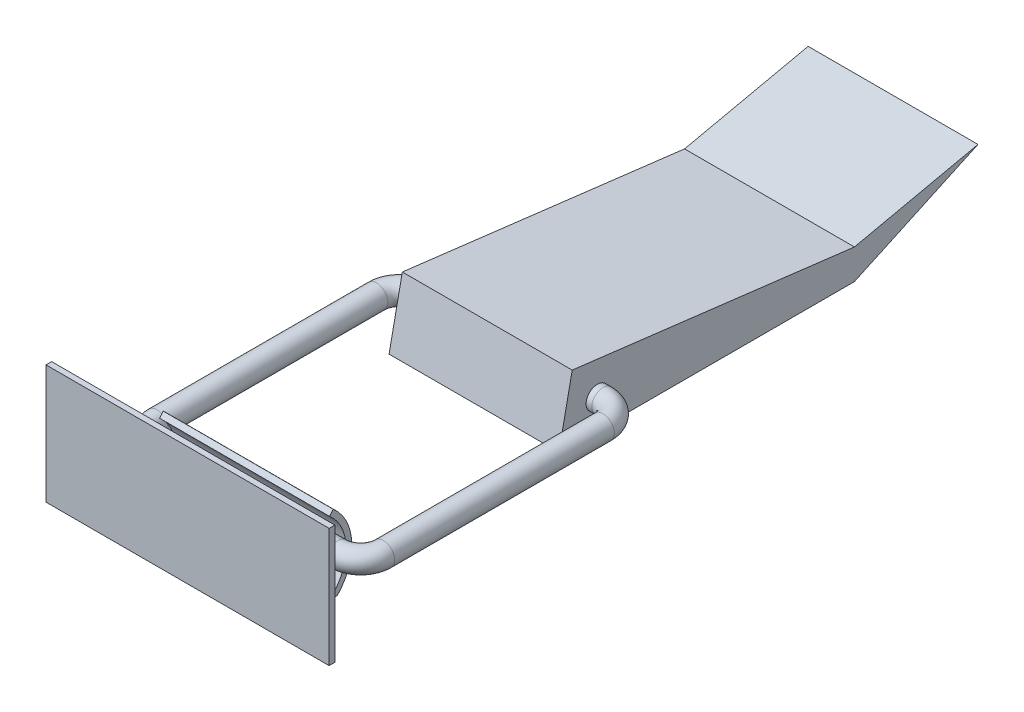
ISO-10303-21;
HEADER;
FILE_DESCRIPTION(('STEP AP214'),'2;1');
FILE_NAME('part.step','',(''),(''),'','','');
FILE_SCHEMA(('AUTOMOTIVE_DESIGN { 1 0 10303 214 1 1 1 1 }'));
ENDSEC;
DATA;
#1=APPLICATION_CONTEXT('core data for automotive mechanical design processes');
#2=APPLICATION_PROTOCOL_DEFINITION('international standard','automotive_design',2000,#1);
#3=PRODUCT_CONTEXT('',#1,'mechanical');
#4=PRODUCT('Part','Part','',(#3));
#5=PRODUCT_RELATED_PRODUCT_CATEGORY('part','',(#4));
#6=PRODUCT_DEFINITION_FORMATION('','',#4);
#7=PRODUCT_DEFINITION_CONTEXT('part definition',#1,'design');
#8=PRODUCT_DEFINITION('design','',#6,#7);
#9=PRODUCT_DEFINITION_SHAPE('','',#8);
#10=(LENGTH_UNIT() NAMED_UNIT(*) SI_UNIT(.MILLI.,.METRE.));
#11=(NAMED_UNIT(*) PLANE_ANGLE_UNIT() SI_UNIT($,.RADIAN.));
#12=(NAMED_UNIT(*) SI_UNIT($,.STERADIAN.) SOLID_ANGLE_UNIT());
#13=UNCERTAINTY_MEASURE_WITH_UNIT(LENGTH_MEASURE(1.E-05),#10,'distance_accuracy_value','');
#14=(GEOMETRIC_REPRESENTATION_CONTEXT(3) GLOBAL_UNCERTAINTY_ASSIGNED_CONTEXT((#13)) GLOBAL_UNIT_ASSIGNED_CONTEXT((#10,
#11,#12)) REPRESENTATION_CONTEXT('',''));
#15=CARTESIAN_POINT('',(0.,0.,0.));
#16=DIRECTION('',(0.,0.,1.));
#17=DIRECTION('',(1.,0.,0.));
#18=AXIS2_PLACEMENT_3D('',#15,#16,#17);
#19=CARTESIAN_POINT('',(15.,2.04308306827095,22.9774417731029));
#20=DIRECTION('',(-1.,0.,0.));
#21=DIRECTION('',(0.,0.,1.));
#22=AXIS2_PLACEMENT_3D('',#19,#20,#21);
#23=CYLINDRICAL_SURFACE('',#22,4.18803925481414);
#24=CARTESIAN_POINT('',(0.,2.04308306827095,22.9774417731029));
#25=DIRECTION('',(-1.,0.,0.));
#26=DIRECTION('',(0.,0.,1.));
#27=AXIS2_PLACEMENT_3D('',#24,#25,#26);
#28=CIRCLE('',#27,4.18803925481414);
#29=CARTESIAN_POINT('',(0.,5.22997262499521,20.2601990984222));
#30=VERTEX_POINT('',#29);
#31=CARTESIAN_POINT('',(0.,-0.674159606409742,19.7905522163787));
#32=VERTEX_POINT('',#31);
#33=EDGE_CURVE('E137',#30,#32,#28,.T.);
#34=ORIENTED_EDGE('',*,*,#33,.T.);
#35=DIRECTION('',(-1.,0.,0.));
#36=VECTOR('',#35,1.);
#37=CARTESIAN_POINT('',(15.,-0.674159606409742,19.7905522163787));
#38=LINE('',#37,#36);
#39=CARTESIAN_POINT('',(15.,-0.674159606409742,19.7905522163787));
#40=VERTEX_POINT('',#39);
#41=EDGE_CURVE('E62',#40,#32,#38,.T.);
#42=ORIENTED_EDGE('',*,*,#41,.F.);
#43=CARTESIAN_POINT('',(15.,2.04308306827095,22.9774417731029));
#44=DIRECTION('',(-1.,0.,0.));
#45=DIRECTION('',(0.,0.,1.));
#46=AXIS2_PLACEMENT_3D('',#43,#44,#45);
#47=CIRCLE('',#46,4.18803925481414);
#48=CARTESIAN_POINT('',(15.,5.22997262499521,20.2601990984222));
#49=VERTEX_POINT('',#48);
#50=EDGE_CURVE('E147',#49,#40,#47,.T.);
#51=ORIENTED_EDGE('',*,*,#50,.F.);
#52=DIRECTION('',(-1.,0.,0.));
#53=VECTOR('',#52,1.);
#54=CARTESIAN_POINT('',(15.,5.22997262499521,20.2601990984222));
#55=LINE('',#54,#53);
#56=EDGE_CURVE('E133',#49,#30,#55,.T.);
#57=ORIENTED_EDGE('',*,*,#56,.T.);
#58=EDGE_LOOP('',(#34,#42,#51,#57));
#59=FACE_BOUND('',#58,.T.);
#60=ADVANCED_FACE('F55',(#59),#23,.F.);
#61=CARTESIAN_POINT('',(15.,-0.674159606409742,19.7905522163787));
#62=DIRECTION('',(0.,-1.,0.));
#63=DIRECTION('',(0.,0.,-1.));
#64=AXIS2_PLACEMENT_3D('',#61,#62,#63);
#65=PLANE('',#64);
#66=DIRECTION('',(0.,0.,1.));
#67=VECTOR('',#66,1.);
#68=CARTESIAN_POINT('',(0.,-0.674159606409742,19.7905522163787));
#69=LINE('',#68,#67);
#70=CARTESIAN_POINT('',(0.,-0.674159606409743,24.7905522163787));
#71=VERTEX_POINT('',#70);
#72=EDGE_CURVE('E140',#32,#71,#69,.T.);
#73=ORIENTED_EDGE('',*,*,#72,.T.);
#74=DIRECTION('',(-1.,0.,0.));
#75=VECTOR('',#74,1.);
#76=CARTESIAN_POINT('',(15.,-0.674159606409743,24.7905522163787));
#77=LINE('',#76,#75);
#78=CARTESIAN_POINT('',(15.,-0.674159606409743,24.7905522163787));
#79=VERTEX_POINT('',#78);
#80=EDGE_CURVE('E158',#79,#71,#77,.T.);
#81=ORIENTED_EDGE('',*,*,#80,.F.);
#82=DIRECTION('',(0.,0.,1.));
#83=VECTOR('',#82,1.);
#84=CARTESIAN_POINT('',(15.,-0.674159606409742,19.7905522163787));
#85=LINE('',#84,#83);
#86=EDGE_CURVE('E106',#40,#79,#85,.T.);
#87=ORIENTED_EDGE('',*,*,#86,.F.);
#88=ORIENTED_EDGE('',*,*,#41,.T.);
#89=EDGE_LOOP('',(#73,#81,#87,#88));
#90=FACE_BOUND('',#89,.T.);
#91=ADVANCED_FACE('F161',(#90),#65,.F.);
#92=CARTESIAN_POINT('',(15.,-0.674159606409743,24.7905522163787));
#93=DIRECTION('',(0.,0.,1.));
#94=DIRECTION('',(1.,0.,0.));
#95=AXIS2_PLACEMENT_3D('',#92,#93,#94);
#96=PLANE('',#95);
#97=ORIENTED_EDGE('',*,*,#80,.T.);
#98=DIRECTION('',(0.,-1.,0.));
#99=VECTOR('',#98,1.);
#100=CARTESIAN_POINT('',(0.,2.04308306827095,24.7905522163787));
#101=LINE('',#100,#99);
#102=CARTESIAN_POINT('',(0.,-1.17415960640974,24.7905522163787));
#103=VERTEX_POINT('',#102);
#104=EDGE_CURVE('E13',#71,#103,#101,.T.);
#105=ORIENTED_EDGE('',*,*,#104,.T.);
#106=DIRECTION('',(1.,0.,0.));
#107=VECTOR('',#106,1.);
#108=CARTESIAN_POINT('',(-5.,-1.17415960640974,24.7905522163787));
#109=LINE('',#108,#107);
#110=CARTESIAN_POINT('',(-5.,-1.17415960640974,24.7905522163787));
#111=VERTEX_POINT('',#110);
#112=EDGE_CURVE('E174',#111,#103,#109,.T.);
#113=ORIENTED_EDGE('',*,*,#112,.F.);
#114=DIRECTION('',(0.,1.,0.));
#115=VECTOR('',#114,1.);
#116=CARTESIAN_POINT('',(-5.,-1.17415960640974,24.7905522163787));
#117=LINE('',#116,#115);
#118=CARTESIAN_POINT('',(-5.,9.32584039359026,24.7905522163787));
#119=VERTEX_POINT('',#118);
#120=EDGE_CURVE('E203',#111,#119,#117,.T.);
#121=ORIENTED_EDGE('',*,*,#120,.T.);
#122=DIRECTION('',(-1.,0.,0.));
#123=VECTOR('',#122,1.);
#124=CARTESIAN_POINT('',(15.,9.32584039359026,24.7905522163787));
#125=LINE('',#124,#123);
#126=CARTESIAN_POINT('',(20.,9.32584039359026,24.7905522163787));
#127=VERTEX_POINT('',#126);
#128=EDGE_CURVE('E155',#127,#119,#125,.T.);
#129=ORIENTED_EDGE('',*,*,#128,.F.);
#130=DIRECTION('',(0.,1.,0.));
#131=VECTOR('',#130,1.);
#132=CARTESIAN_POINT('',(20.,-1.17415960640974,24.7905522163787));
#133=LINE('',#132,#131);
#134=CARTESIAN_POINT('',(20.,-1.17415960640974,24.7905522163787));
#135=VERTEX_POINT('',#134);
#136=EDGE_CURVE('E189',#135,#127,#133,.T.);
#137=ORIENTED_EDGE('',*,*,#136,.F.);
#138=CARTESIAN_POINT('',(15.,-1.17415960640974,24.7905522163787));
#139=VERTEX_POINT('',#138);
#140=EDGE_CURVE('E179',#139,#135,#109,.T.);
#141=ORIENTED_EDGE('',*,*,#140,.F.);
#142=DIRECTION('',(0.,-1.,0.));
#143=VECTOR('',#142,1.);
#144=CARTESIAN_POINT('',(15.,2.04308306827095,24.7905522163787));
#145=LINE('',#144,#143);
#146=EDGE_CURVE('E69',#79,#139,#145,.T.);
#147=ORIENTED_EDGE('',*,*,#146,.F.);
#148=EDGE_LOOP('',(#97,#105,#113,#121,#129,#137,#141,#147));
#149=FACE_BOUND('',#148,.T.);
#150=ADVANCED_FACE('F171',(#149),#96,.F.);
#151=CARTESIAN_POINT('',(15.,9.32584039359026,25.2905522163787));
#152=DIRECTION('',(0.,-1.,0.));
#153=DIRECTION('',(0.,0.,-1.));
#154=AXIS2_PLACEMENT_3D('',#151,#152,#153);
#155=PLANE('',#154);
#156=ORIENTED_EDGE('',*,*,#128,.T.);
#157=DIRECTION('',(0.,0.,1.));
#158=VECTOR('',#157,1.);
#159=CARTESIAN_POINT('',(-5.,9.32584039359026,24.7905522163787));
#160=LINE('',#159,#158);
#161=CARTESIAN_POINT('',(-5.,9.32584039359026,25.2905522163787));
#162=VERTEX_POINT('',#161);
#163=EDGE_CURVE('E205',#119,#162,#160,.T.);
#164=ORIENTED_EDGE('',*,*,#163,.T.);
#165=DIRECTION('',(-1.,0.,0.));
#166=VECTOR('',#165,1.);
#167=CARTESIAN_POINT('',(15.,9.32584039359026,25.2905522163787));
#168=LINE('',#167,#166);
#169=CARTESIAN_POINT('',(20.,9.32584039359026,25.2905522163787));
#170=VERTEX_POINT('',#169);
#171=EDGE_CURVE('E152',#170,#162,#168,.T.);
#172=ORIENTED_EDGE('',*,*,#171,.F.);
#173=DIRECTION('',(0.,0.,1.));
#174=VECTOR('',#173,1.);
#175=CARTESIAN_POINT('',(20.,9.32584039359026,24.7905522163787));
#176=LINE('',#175,#174);
#177=EDGE_CURVE('E207',#127,#170,#176,.T.);
#178=ORIENTED_EDGE('',*,*,#177,.F.);
#179=EDGE_LOOP('',(#156,#164,#172,#178));
#180=FACE_BOUND('',#179,.T.);
#181=ADVANCED_FACE('F234',(#180),#155,.F.);
#182=CARTESIAN_POINT('',(15.,-1.17415960640974,25.2905522163787));
#183=DIRECTION('',(0.,0.,-1.));
#184=DIRECTION('',(-1.,0.,0.));
#185=AXIS2_PLACEMENT_3D('',#182,#183,#184);
#186=PLANE('',#185);
#187=ORIENTED_EDGE('',*,*,#171,.T.);
#188=DIRECTION('',(0.,-1.,0.));
#189=VECTOR('',#188,1.);
#190=CARTESIAN_POINT('',(-5.,9.32584039359026,25.2905522163787));
#191=LINE('',#190,#189);
#192=CARTESIAN_POINT('',(-5.,-1.17415960640974,25.2905522163787));
#193=VERTEX_POINT('',#192);
#194=EDGE_CURVE('E212',#162,#193,#191,.T.);
#195=ORIENTED_EDGE('',*,*,#194,.T.);
#196=DIRECTION('',(-1.,0.,0.));
#197=VECTOR('',#196,1.);
#198=CARTESIAN_POINT('',(15.,-1.17415960640974,25.2905522163787));
#199=LINE('',#198,#197);
#200=CARTESIAN_POINT('',(20.,-1.17415960640974,25.2905522163787));
#201=VERTEX_POINT('',#200);
#202=EDGE_CURVE('E128',#201,#193,#199,.T.);
#203=ORIENTED_EDGE('',*,*,#202,.F.);
#204=DIRECTION('',(0.,-1.,0.));
#205=VECTOR('',#204,1.);
#206=CARTESIAN_POINT('',(20.,9.32584039359026,25.2905522163787));
#207=LINE('',#206,#205);
#208=EDGE_CURVE('E202',#170,#201,#207,.T.);
#209=ORIENTED_EDGE('',*,*,#208,.F.);
#210=EDGE_LOOP('',(#187,#195,#203,#209));
#211=FACE_BOUND('',#210,.T.);
#212=ADVANCED_FACE('F218',(#211),#186,.F.);
#213=CARTESIAN_POINT('',(15.,-1.17415960640974,19.5675940306236));
#214=DIRECTION('',(0.,1.,0.));
#215=DIRECTION('',(0.,0.,1.));
#216=AXIS2_PLACEMENT_3D('',#213,#214,#215);
#217=PLANE('',#216);
#218=DIRECTION('',(0.,0.,-1.));
#219=VECTOR('',#218,1.);
#220=CARTESIAN_POINT('',(15.,-1.17415960640974,19.5675940306236));
#221=LINE('',#220,#219);
#222=CARTESIAN_POINT('',(15.,-1.17415960640974,19.5675940306236));
#223=VERTEX_POINT('',#222);
#224=EDGE_CURVE('E110',#139,#223,#221,.T.);
#225=ORIENTED_EDGE('',*,*,#224,.F.);
#226=ORIENTED_EDGE('',*,*,#140,.T.);
#227=DIRECTION('',(0.,0.,-1.));
#228=VECTOR('',#227,1.);
#229=CARTESIAN_POINT('',(20.,-1.17415960640974,25.2905522163787));
#230=LINE('',#229,#228);
#231=EDGE_CURVE('E193',#201,#135,#230,.T.);
#232=ORIENTED_EDGE('',*,*,#231,.F.);
#233=ORIENTED_EDGE('',*,*,#202,.T.);
#234=DIRECTION('',(0.,0.,-1.));
#235=VECTOR('',#234,1.);
#236=CARTESIAN_POINT('',(-5.,-1.17415960640974,25.2905522163787));
#237=LINE('',#236,#235);
#238=EDGE_CURVE('E178',#193,#111,#237,.T.);
#239=ORIENTED_EDGE('',*,*,#238,.T.);
#240=ORIENTED_EDGE('',*,*,#112,.T.);
#241=DIRECTION('',(0.,0.,-1.));
#242=VECTOR('',#241,1.);
#243=CARTESIAN_POINT('',(0.,-1.17415960640974,19.5675940306236));
#244=LINE('',#243,#242);
#245=CARTESIAN_POINT('',(0.,-1.17415960640974,19.5675940306236));
#246=VERTEX_POINT('',#245);
#247=EDGE_CURVE('E125',#103,#246,#244,.T.);
#248=ORIENTED_EDGE('',*,*,#247,.T.);
#249=DIRECTION('',(-1.,0.,0.));
#250=VECTOR('',#249,1.);
#251=CARTESIAN_POINT('',(15.,-1.17415960640974,19.5675940306236));
#252=LINE('',#251,#250);
#253=EDGE_CURVE('E121',#223,#246,#252,.T.);
#254=ORIENTED_EDGE('',*,*,#253,.F.);
#255=EDGE_LOOP('',(#225,#226,#232,#233,#239,#240,#248,#254));
#256=FACE_BOUND('',#255,.T.);
#257=ADVANCED_FACE('F122',(#256),#217,.F.);
#258=CARTESIAN_POINT('',(15.,2.04308306827095,22.9774417731029));
#259=DIRECTION('',(-1.,0.,0.));
#260=DIRECTION('',(0.,0.,1.));
#261=AXIS2_PLACEMENT_3D('',#258,#259,#260);
#262=CYLINDRICAL_SURFACE('',#261,4.68803925481414);
#263=CARTESIAN_POINT('',(0.,2.04308306827095,22.9774417731029));
#264=DIRECTION('',(1.,0.,0.));
#265=DIRECTION('',(0.,0.,1.));
#266=AXIS2_PLACEMENT_3D('',#263,#264,#265);
#267=CIRCLE('',#266,4.68803925481414);
#268=CARTESIAN_POINT('',(0.,5.61044775462311,19.9357939878974));
#269=VERTEX_POINT('',#268);
#270=EDGE_CURVE('E144',#246,#269,#267,.T.);
#271=ORIENTED_EDGE('',*,*,#270,.T.);
#272=DIRECTION('',(-1.,0.,0.));
#273=VECTOR('',#272,1.);
#274=CARTESIAN_POINT('',(15.,5.61044775462311,19.9357939878974));
#275=LINE('',#274,#273);
#276=CARTESIAN_POINT('',(15.,5.61044775462311,19.9357939878974));
#277=VERTEX_POINT('',#276);
#278=EDGE_CURVE('E129',#277,#269,#275,.T.);
#279=ORIENTED_EDGE('',*,*,#278,.F.);
#280=CARTESIAN_POINT('',(15.,2.04308306827095,22.9774417731029));
#281=DIRECTION('',(1.,0.,0.));
#282=DIRECTION('',(0.,0.,1.));
#283=AXIS2_PLACEMENT_3D('',#280,#281,#282);
#284=CIRCLE('',#283,4.68803925481414);
#285=EDGE_CURVE('E114',#223,#277,#284,.T.);
#286=ORIENTED_EDGE('',*,*,#285,.F.);
#287=ORIENTED_EDGE('',*,*,#253,.T.);
#288=EDGE_LOOP('',(#271,#279,#286,#287));
#289=FACE_BOUND('',#288,.T.);
#290=ADVANCED_FACE('F131',(#289),#262,.T.);
#291=CARTESIAN_POINT('',(15.,5.22997262499521,20.2601990984222));
#292=DIRECTION('',(0.,-0.648810221049685,-0.760950259255793));
#293=DIRECTION('',(0.,0.760950259255793,-0.648810221049685));
#294=AXIS2_PLACEMENT_3D('',#291,#292,#293);
#295=PLANE('',#294);
#296=DIRECTION('',(0.,-0.760950259255793,0.648810221049685));
#297=VECTOR('',#296,1.);
#298=CARTESIAN_POINT('',(0.,5.22997262499521,20.2601990984222));
#299=LINE('',#298,#297);
#300=EDGE_CURVE('E98',#269,#30,#299,.T.);
#301=ORIENTED_EDGE('',*,*,#300,.T.);
#302=ORIENTED_EDGE('',*,*,#56,.F.);
#303=DIRECTION('',(0.,-0.760950259255793,0.648810221049685));
#304=VECTOR('',#303,1.);
#305=CARTESIAN_POINT('',(15.,5.22997262499521,20.2601990984222));
#306=LINE('',#305,#304);
#307=EDGE_CURVE('E77',#277,#49,#306,.T.);
#308=ORIENTED_EDGE('',*,*,#307,.F.);
#309=ORIENTED_EDGE('',*,*,#278,.T.);
#310=EDGE_LOOP('',(#301,#302,#308,#309));
#311=FACE_BOUND('',#310,.T.);
#312=ADVANCED_FACE('F289',(#311),#295,.F.);
#313=CARTESIAN_POINT('',(15.,2.04308306827095,22.9774417731029));
#314=DIRECTION('',(-1.,0.,0.));
#315=DIRECTION('',(0.,0.,1.));
#316=AXIS2_PLACEMENT_3D('',#313,#314,#315);
#317=PLANE('',#316);
#318=ORIENTED_EDGE('',*,*,#86,.T.);
#319=ORIENTED_EDGE('',*,*,#146,.T.);
#320=ORIENTED_EDGE('',*,*,#224,.T.);
#321=ORIENTED_EDGE('',*,*,#285,.T.);
#322=ORIENTED_EDGE('',*,*,#307,.T.);
#323=ORIENTED_EDGE('',*,*,#50,.T.);
#324=EDGE_LOOP('',(#318,#319,#320,#321,#322,#323));
#325=FACE_BOUND('',#324,.T.);
#326=ADVANCED_FACE('F112',(#325),#317,.F.);
#327=CARTESIAN_POINT('',(0.,2.04308306827095,22.9774417731029));
#328=DIRECTION('',(-1.,0.,0.));
#329=DIRECTION('',(0.,0.,1.));
#330=AXIS2_PLACEMENT_3D('',#327,#328,#329);
#331=PLANE('',#330);
#332=ORIENTED_EDGE('',*,*,#104,.F.);
#333=ORIENTED_EDGE('',*,*,#72,.F.);
#334=ORIENTED_EDGE('',*,*,#33,.F.);
#335=ORIENTED_EDGE('',*,*,#300,.F.);
#336=ORIENTED_EDGE('',*,*,#270,.F.);
#337=ORIENTED_EDGE('',*,*,#247,.F.);
#338=EDGE_LOOP('',(#332,#333,#334,#335,#336,#337));
#339=FACE_BOUND('',#338,.T.);
#340=ADVANCED_FACE('F167',(#339),#331,.T.);
#341=CARTESIAN_POINT('',(-5.,0.,0.));
#342=DIRECTION('',(1.,0.,0.));
#343=DIRECTION('',(0.,0.,-1.));
#344=AXIS2_PLACEMENT_3D('',#341,#342,#343);
#345=PLANE('',#344);
#346=ORIENTED_EDGE('',*,*,#120,.F.);
#347=ORIENTED_EDGE('',*,*,#238,.F.);
#348=ORIENTED_EDGE('',*,*,#194,.F.);
#349=ORIENTED_EDGE('',*,*,#163,.F.);
#350=EDGE_LOOP('',(#346,#347,#348,#349));
#351=FACE_BOUND('',#350,.T.);
#352=ADVANCED_FACE('F224',(#351),#345,.F.);
#353=CARTESIAN_POINT('',(20.,0.,0.));
#354=DIRECTION('',(1.,0.,0.));
#355=DIRECTION('',(0.,0.,-1.));
#356=AXIS2_PLACEMENT_3D('',#353,#354,#355);
#357=PLANE('',#356);
#358=ORIENTED_EDGE('',*,*,#136,.T.);
#359=ORIENTED_EDGE('',*,*,#177,.T.);
#360=ORIENTED_EDGE('',*,*,#208,.T.);
#361=ORIENTED_EDGE('',*,*,#231,.T.);
#362=EDGE_LOOP('',(#358,#359,#360,#361));
#363=FACE_BOUND('',#362,.T.);
#364=ADVANCED_FACE('F198',(#363),#357,.T.);
#365=CLOSED_SHELL('',(#60,#91,#150,#181,#212,#257,#290,#312,#326,#340,#352,#364));
#366=MANIFOLD_SOLID_BREP('B2',#365);
#367=CARTESIAN_POINT('',(15.,0.,-26.0909090909091));
#368=DIRECTION('',(0.,1.,0.));
#369=DIRECTION('',(0.,0.,1.));
#370=AXIS2_PLACEMENT_3D('',#367,#368,#369);
#371=PLANE('',#370);
#372=DIRECTION('',(0.,0.,-1.));
#373=VECTOR('',#372,1.);
#374=CARTESIAN_POINT('',(0.,0.,-26.0909090909091));
#375=LINE('',#374,#373);
#376=CARTESIAN_POINT('',(0.,0.,0.));
#377=VERTEX_POINT('',#376);
#378=CARTESIAN_POINT('',(0.,0.,-26.0909090909091));
#379=VERTEX_POINT('',#378);
#380=EDGE_CURVE('E422',#377,#379,#375,.T.);
#381=ORIENTED_EDGE('',*,*,#380,.T.);
#382=DIRECTION('',(-1.,0.,0.));
#383=VECTOR('',#382,1.);
#384=CARTESIAN_POINT('',(15.,0.,-26.0909090909091));
#385=LINE('',#384,#383);
#386=CARTESIAN_POINT('',(15.,0.,-26.0909090909091));
#387=VERTEX_POINT('',#386);
#388=EDGE_CURVE('E354',#387,#379,#385,.T.);
#389=ORIENTED_EDGE('',*,*,#388,.F.);
#390=DIRECTION('',(0.,0.,-1.));
#391=VECTOR('',#390,1.);
#392=CARTESIAN_POINT('',(15.,0.,-26.0909090909091));
#393=LINE('',#392,#391);
#394=CARTESIAN_POINT('',(15.,0.,0.));
#395=VERTEX_POINT('',#394);
#396=EDGE_CURVE('E431',#395,#387,#393,.T.);
#397=ORIENTED_EDGE('',*,*,#396,.F.);
#398=DIRECTION('',(-1.,0.,0.));
#399=VECTOR('',#398,1.);
#400=CARTESIAN_POINT('',(15.,0.,0.));
#401=LINE('',#400,#399);
#402=EDGE_CURVE('E418',#395,#377,#401,.T.);
#403=ORIENTED_EDGE('',*,*,#402,.T.);
#404=EDGE_LOOP('',(#381,#389,#397,#403));
#405=FACE_BOUND('',#404,.T.);
#406=ADVANCED_FACE('F346',(#405),#371,.F.);
#407=CARTESIAN_POINT('',(15.,5.03627859485815,-37.));
#408=DIRECTION('',(0.,0.907917784313585,0.419148299444375));
#409=DIRECTION('',(0.,-0.419148299444375,0.907917784313585));
#410=AXIS2_PLACEMENT_3D('',#407,#408,#409);
#411=PLANE('',#410);
#412=DIRECTION('',(0.,0.419148299444375,-0.907917784313585));
#413=VECTOR('',#412,1.);
#414=CARTESIAN_POINT('',(0.,5.03627859485815,-37.));
#415=LINE('',#414,#413);
#416=CARTESIAN_POINT('',(0.,5.03627859485815,-37.));
#417=VERTEX_POINT('',#416);
#418=EDGE_CURVE('E425',#379,#417,#415,.T.);
#419=ORIENTED_EDGE('',*,*,#418,.T.);
#420=DIRECTION('',(-1.,0.,0.));
#421=VECTOR('',#420,1.);
#422=CARTESIAN_POINT('',(15.,5.03627859485815,-37.));
#423=LINE('',#422,#421);
#424=CARTESIAN_POINT('',(15.,5.03627859485815,-37.));
#425=VERTEX_POINT('',#424);
#426=EDGE_CURVE('E413',#425,#417,#423,.T.);
#427=ORIENTED_EDGE('',*,*,#426,.F.);
#428=DIRECTION('',(0.,0.419148299444375,-0.907917784313585));
#429=VECTOR('',#428,1.);
#430=CARTESIAN_POINT('',(15.,5.03627859485815,-37.));
#431=LINE('',#430,#429);
#432=EDGE_CURVE('E397',#387,#425,#431,.T.);
#433=ORIENTED_EDGE('',*,*,#432,.F.);
#434=ORIENTED_EDGE('',*,*,#388,.T.);
#435=EDGE_LOOP('',(#419,#427,#433,#434));
#436=FACE_BOUND('',#435,.T.);
#437=ADVANCED_FACE('F435',(#436),#411,.F.);
#438=CARTESIAN_POINT('',(15.,2.64974360409875,-26.0909090909091));
#439=DIRECTION('',(0.,-0.976896813941771,-0.213711522643062));
#440=DIRECTION('',(0.,0.213711522643062,-0.976896813941771));
#441=AXIS2_PLACEMENT_3D('',#438,#439,#440);
#442=PLANE('',#441);
#443=DIRECTION('',(0.,-0.213711522643062,0.976896813941771));
#444=VECTOR('',#443,1.);
#445=CARTESIAN_POINT('',(0.,2.64974360409875,-26.0909090909091));
#446=LINE('',#445,#444);
#447=CARTESIAN_POINT('',(0.,2.64974360409875,-26.0909090909091));
#448=VERTEX_POINT('',#447);
#449=EDGE_CURVE('E412',#417,#448,#446,.T.);
#450=ORIENTED_EDGE('',*,*,#449,.T.);
#451=DIRECTION('',(-1.,0.,0.));
#452=VECTOR('',#451,1.);
#453=CARTESIAN_POINT('',(15.,2.64974360409875,-26.0909090909091));
#454=LINE('',#453,#452);
#455=CARTESIAN_POINT('',(15.,2.64974360409875,-26.0909090909091));
#456=VERTEX_POINT('',#455);
#457=EDGE_CURVE('E409',#456,#448,#454,.T.);
#458=ORIENTED_EDGE('',*,*,#457,.F.);
#459=DIRECTION('',(0.,-0.213711522643062,0.976896813941771));
#460=VECTOR('',#459,1.);
#461=CARTESIAN_POINT('',(15.,2.64974360409875,-26.0909090909091));
#462=LINE('',#461,#460);
#463=EDGE_CURVE('E401',#425,#456,#462,.T.);
#464=ORIENTED_EDGE('',*,*,#463,.F.);
#465=ORIENTED_EDGE('',*,*,#426,.T.);
#466=EDGE_LOOP('',(#450,#458,#464,#465));
#467=FACE_BOUND('',#466,.T.);
#468=ADVANCED_FACE('F410',(#467),#442,.F.);
#469=CARTESIAN_POINT('',(15.,5.69638401783415,-1.17185090123745));
#470=DIRECTION('',(0.,-0.992608827044455,0.121357803512717));
#471=DIRECTION('',(0.,-0.121357803512717,-0.992608827044455));
#472=AXIS2_PLACEMENT_3D('',#469,#470,#471);
#473=PLANE('',#472);
#474=DIRECTION('',(0.,0.121357803512717,0.992608827044455));
#475=VECTOR('',#474,1.);
#476=CARTESIAN_POINT('',(0.,5.69638401783415,-1.17185090123745));
#477=LINE('',#476,#475);
#478=CARTESIAN_POINT('',(0.,5.69638401783415,-1.17185090123745));
#479=VERTEX_POINT('',#478);
#480=EDGE_CURVE('E382',#448,#479,#477,.T.);
#481=ORIENTED_EDGE('',*,*,#480,.T.);
#482=DIRECTION('',(-1.,0.,0.));
#483=VECTOR('',#482,1.);
#484=CARTESIAN_POINT('',(15.,5.69638401783415,-1.17185090123745));
#485=LINE('',#484,#483);
#486=CARTESIAN_POINT('',(15.,5.69638401783415,-1.17185090123745));
#487=VERTEX_POINT('',#486);
#488=EDGE_CURVE('E414',#487,#479,#485,.T.);
#489=ORIENTED_EDGE('',*,*,#488,.F.);
#490=DIRECTION('',(0.,0.121357803512717,0.992608827044455));
#491=VECTOR('',#490,1.);
#492=CARTESIAN_POINT('',(15.,5.69638401783415,-1.17185090123745));
#493=LINE('',#492,#491);
#494=EDGE_CURVE('E405',#456,#487,#493,.T.);
#495=ORIENTED_EDGE('',*,*,#494,.F.);
#496=ORIENTED_EDGE('',*,*,#457,.T.);
#497=EDGE_LOOP('',(#481,#489,#495,#496));
#498=FACE_BOUND('',#497,.T.);
#499=ADVANCED_FACE('F416',(#498),#473,.F.);
#500=CARTESIAN_POINT('',(15.,0.,0.));
#501=DIRECTION('',(0.,-0.201498841061324,-0.979488752896603));
#502=DIRECTION('',(0.,0.979488752896604,-0.201498841061324));
#503=AXIS2_PLACEMENT_3D('',#500,#501,#502);
#504=PLANE('',#503);
#505=DIRECTION('',(0.,-0.979488752896603,0.201498841061324));
#506=VECTOR('',#505,1.);
#507=CARTESIAN_POINT('',(0.,0.,0.));
#508=LINE('',#507,#506);
#509=EDGE_CURVE('E388',#479,#377,#508,.T.);
#510=ORIENTED_EDGE('',*,*,#509,.T.);
#511=ORIENTED_EDGE('',*,*,#402,.F.);
#512=DIRECTION('',(0.,-0.979488752896603,0.201498841061324));
#513=VECTOR('',#512,1.);
#514=CARTESIAN_POINT('',(15.,0.,0.));
#515=LINE('',#514,#513);
#516=EDGE_CURVE('E362',#487,#395,#515,.T.);
#517=ORIENTED_EDGE('',*,*,#516,.F.);
#518=ORIENTED_EDGE('',*,*,#488,.T.);
#519=EDGE_LOOP('',(#510,#511,#517,#518));
#520=FACE_BOUND('',#519,.T.);
#521=ADVANCED_FACE('F453',(#520),#504,.F.);
#522=CARTESIAN_POINT('',(15.,0.,0.));
#523=DIRECTION('',(-1.,0.,0.));
#524=DIRECTION('',(0.,0.,1.));
#525=AXIS2_PLACEMENT_3D('',#522,#523,#524);
#526=PLANE('',#525);
#527=CARTESIAN_POINT('',(15.,2.5,-3.39620624033235));
#528=DIRECTION('',(-1.,0.,0.));
#529=DIRECTION('',(0.,0.,1.));
#530=AXIS2_PLACEMENT_3D('',#527,#528,#529);
#531=CIRCLE('',#530,1.);
#532=CARTESIAN_POINT('',(15.,2.5,-2.39620624033235));
#533=VERTEX_POINT('',#532);
#534=EDGE_CURVE('E53',#533,#533,#531,.F.);
#535=ORIENTED_EDGE('',*,*,#534,.F.);
#536=EDGE_LOOP('',(#535));
#537=FACE_BOUND('',#536,.T.);
#538=ORIENTED_EDGE('',*,*,#396,.T.);
#539=ORIENTED_EDGE('',*,*,#432,.T.);
#540=ORIENTED_EDGE('',*,*,#463,.T.);
#541=ORIENTED_EDGE('',*,*,#494,.T.);
#542=ORIENTED_EDGE('',*,*,#516,.T.);
#543=EDGE_LOOP('',(#538,#539,#540,#541,#542));
#544=FACE_BOUND('',#543,.T.);
#545=ADVANCED_FACE('F403',(#537,#544),#526,.F.);
#546=CARTESIAN_POINT('',(0.,0.,0.));
#547=DIRECTION('',(-1.,0.,0.));
#548=DIRECTION('',(0.,0.,1.));
#549=AXIS2_PLACEMENT_3D('',#546,#547,#548);
#550=PLANE('',#549);
#551=CARTESIAN_POINT('',(0.,2.5,-3.39620624033236));
#552=DIRECTION('',(-1.,0.,0.));
#553=DIRECTION('',(0.,0.,1.));
#554=AXIS2_PLACEMENT_3D('',#551,#552,#553);
#555=CIRCLE('',#554,1.);
#556=CARTESIAN_POINT('',(0.,2.5,-2.39620624033236));
#557=VERTEX_POINT('',#556);
#558=EDGE_CURVE('E426',#557,#557,#555,.T.);
#559=ORIENTED_EDGE('',*,*,#558,.F.);
#560=EDGE_LOOP('',(#559));
#561=FACE_BOUND('',#560,.T.);
#562=ORIENTED_EDGE('',*,*,#380,.F.);
#563=ORIENTED_EDGE('',*,*,#509,.F.);
#564=ORIENTED_EDGE('',*,*,#480,.F.);
#565=ORIENTED_EDGE('',*,*,#449,.F.);
#566=ORIENTED_EDGE('',*,*,#418,.F.);
#567=EDGE_LOOP('',(#562,#563,#564,#565,#566));
#568=FACE_BOUND('',#567,.T.);
#569=ADVANCED_FACE('F440',(#561,#568),#550,.T.);
#570=CARTESIAN_POINT('',(15.,2.5,-3.39620624033235));
#571=DIRECTION('',(1.,0.,0.));
#572=DIRECTION('',(0.,0.,-1.));
#573=AXIS2_PLACEMENT_3D('',#570,#571,#572);
#574=CYLINDRICAL_SURFACE('',#573,1.);
#575=CARTESIAN_POINT('',(15.5,2.5,-3.39620624033235));
#576=DIRECTION('',(-1.,0.,0.));
#577=DIRECTION('',(0.,0.,1.));
#578=AXIS2_PLACEMENT_3D('',#575,#576,#577);
#579=CIRCLE('',#578,1.);
#580=CARTESIAN_POINT('',(15.5,2.5,-4.39620624033235));
#581=VERTEX_POINT('',#580);
#582=EDGE_CURVE('E598',#581,#581,#579,.T.);
#583=ORIENTED_EDGE('',*,*,#582,.T.);
#584=EDGE_LOOP('',(#583));
#585=FACE_BOUND('',#584,.T.);
#586=ORIENTED_EDGE('',*,*,#534,.T.);
#587=EDGE_LOOP('',(#586));
#588=FACE_BOUND('',#587,.T.);
#589=ADVANCED_FACE('F442',(#585,#588),#574,.T.);
#590=CARTESIAN_POINT('',(15.5,2.5,-1.39620624033235));
#591=DIRECTION('',(0.,-1.,0.));
#592=DIRECTION('',(0.,0.,-1.));
#593=AXIS2_PLACEMENT_3D('',#590,#591,#592);
#594=TOROIDAL_SURFACE('',#593,2.,1.);
#595=CARTESIAN_POINT('',(17.5,2.5,-1.39620624033235));
#596=DIRECTION('',(0.,0.,-1.));
#597=DIRECTION('',(-1.,0.,0.));
#598=AXIS2_PLACEMENT_3D('',#595,#596,#597);
#599=CIRCLE('',#598,1.);
#600=CARTESIAN_POINT('',(18.5,2.5,-1.39620624033235));
#601=VERTEX_POINT('',#600);
#602=EDGE_CURVE('E595',#601,#601,#599,.T.);
#603=CARTESIAN_POINT('',(15.5,2.5,-1.39620624033235));
#604=DIRECTION('',(0.,-1.,0.));
#605=DIRECTION('',(0.,0.,-1.));
#606=AXIS2_PLACEMENT_3D('',#603,#604,#605);
#607=CIRCLE('',#606,3.);
#608=EDGE_CURVE('',#581,#601,#607,.T.);
#609=ORIENTED_EDGE('',*,*,#582,.F.);
#610=ORIENTED_EDGE('',*,*,#602,.T.);
#611=ORIENTED_EDGE('',*,*,#608,.T.);
#612=ORIENTED_EDGE('',*,*,#608,.F.);
#613=EDGE_LOOP('',(#609,#611,#610,#612));
#614=FACE_BOUND('',#613,.T.);
#615=ADVANCED_FACE('F450',(#614),#594,.T.);
#616=CARTESIAN_POINT('',(17.5,2.5,-1.39620624033235));
#617=DIRECTION('',(0.,0.,1.));
#618=DIRECTION('',(1.,0.,0.));
#619=AXIS2_PLACEMENT_3D('',#616,#617,#618);
#620=CYLINDRICAL_SURFACE('',#619,1.);
#621=CARTESIAN_POINT('',(17.5,2.5,18.));
#622=DIRECTION('',(0.,0.,-1.));
#623=DIRECTION('',(-1.,0.,0.));
#624=AXIS2_PLACEMENT_3D('',#621,#622,#623);
#625=CIRCLE('',#624,1.);
#626=CARTESIAN_POINT('',(18.5,2.5,18.));
#627=VERTEX_POINT('',#626);
#628=EDGE_CURVE('E592',#627,#627,#625,.T.);
#629=CARTESIAN_POINT('',(18.5,2.5,18.));
#630=CARTESIAN_POINT('',(18.5,2.5,17.7979561849965));
#631=CARTESIAN_POINT('',(18.5,2.5,17.5959123699931));
#632=CARTESIAN_POINT('',(18.5,2.5,17.1918247399861));
#633=CARTESIAN_POINT('',(18.5,2.5,16.9897809249827));
#634=CARTESIAN_POINT('',(18.5,2.5,16.5856932949758));
#635=CARTESIAN_POINT('',(18.5,2.5,16.3836494799723));
#636=CARTESIAN_POINT('',(18.5,2.5,15.9795618499654));
#637=CARTESIAN_POINT('',(18.5,2.5,15.7775180349619));
#638=CARTESIAN_POINT('',(18.5,2.5,15.373430404955));
#639=CARTESIAN_POINT('',(18.5,2.5,15.1713865899515));
#640=CARTESIAN_POINT('',(18.5,2.5,14.7672989599446));
#641=CARTESIAN_POINT('',(18.5,2.5,14.5652551449411));
#642=CARTESIAN_POINT('',(18.5,2.5,14.1611675149342));
#643=CARTESIAN_POINT('',(18.5,2.5,13.9591236999308));
#644=CARTESIAN_POINT('',(18.5,2.5,13.5550360699238));
#645=CARTESIAN_POINT('',(18.5,2.5,13.3529922549204));
#646=CARTESIAN_POINT('',(18.5,2.5,12.9489046249134));
#647=CARTESIAN_POINT('',(18.5,2.5,12.74686080991));
#648=CARTESIAN_POINT('',(18.5,2.5,12.3427731799031));
#649=CARTESIAN_POINT('',(18.5,2.5,12.1407293648996));
#650=CARTESIAN_POINT('',(18.5,2.5,11.7366417348927));
#651=CARTESIAN_POINT('',(18.5,2.5,11.5345979198892));
#652=CARTESIAN_POINT('',(18.5,2.5,11.1305102898823));
#653=CARTESIAN_POINT('',(18.5,2.5,10.9284664748788));
#654=CARTESIAN_POINT('',(18.5,2.5,10.5243788448719));
#655=CARTESIAN_POINT('',(18.5,2.5,10.3223350298684));
#656=CARTESIAN_POINT('',(18.5,2.5,9.91824739986152));
#657=CARTESIAN_POINT('',(18.5,2.5,9.71620358485806));
#658=CARTESIAN_POINT('',(18.5,2.5,9.31211595485113));
#659=CARTESIAN_POINT('',(18.5,2.5,9.11007213984767));
#660=CARTESIAN_POINT('',(18.5,2.5,8.70598450984075));
#661=CARTESIAN_POINT('',(18.5,2.5,8.50394069483728));
#662=CARTESIAN_POINT('',(18.5,2.5,8.09985306483036));
#663=CARTESIAN_POINT('',(18.5,2.5,7.8978092498269));
#664=CARTESIAN_POINT('',(18.5,2.5,7.49372161981998));
#665=CARTESIAN_POINT('',(18.5,2.5,7.29167780481651));
#666=CARTESIAN_POINT('',(18.5,2.5,6.88759017480959));
#667=CARTESIAN_POINT('',(18.5,2.5,6.68554635980613));
#668=CARTESIAN_POINT('',(18.5,2.5,6.2814587297992));
#669=CARTESIAN_POINT('',(18.5,2.5,6.07941491479574));
#670=CARTESIAN_POINT('',(18.5,2.5,5.67532728478882));
#671=CARTESIAN_POINT('',(18.5,2.5,5.47328346978535));
#672=CARTESIAN_POINT('',(18.5,2.5,5.06919583977843));
#673=CARTESIAN_POINT('',(18.5,2.5,4.86715202477497));
#674=CARTESIAN_POINT('',(18.5,2.5,4.46306439476805));
#675=CARTESIAN_POINT('',(18.5,2.5,4.26102057976458));
#676=CARTESIAN_POINT('',(18.5,2.5,3.85693294975766));
#677=CARTESIAN_POINT('',(18.5,2.5,3.6548891347542));
#678=CARTESIAN_POINT('',(18.5,2.5,3.25080150474727));
#679=CARTESIAN_POINT('',(18.5,2.5,3.04875768974381));
#680=CARTESIAN_POINT('',(18.5,2.5,2.64467005973689));
#681=CARTESIAN_POINT('',(18.5,2.5,2.44262624473342));
#682=CARTESIAN_POINT('',(18.5,2.5,2.0385386147265));
#683=CARTESIAN_POINT('',(18.5,2.5,1.83649479972304));
#684=CARTESIAN_POINT('',(18.5,2.5,1.43240716971611));
#685=CARTESIAN_POINT('',(18.5,2.5,1.23036335471265));
#686=CARTESIAN_POINT('',(18.5,2.5,0.82627572470573));
#687=CARTESIAN_POINT('',(18.5,2.5,0.624231909702268));
#688=CARTESIAN_POINT('',(18.5,2.5,0.220144279695343));
#689=CARTESIAN_POINT('',(18.5,2.5,0.0181004646918799));
#690=CARTESIAN_POINT('',(18.5,2.5,-0.385987165315045));
#691=CARTESIAN_POINT('',(18.5,2.5,-0.588030980318507));
#692=CARTESIAN_POINT('',(18.5,2.5,-0.99211861032543));
#693=CARTESIAN_POINT('',(18.5,2.5,-1.19416242532889));
#694=CARTESIAN_POINT('',(18.5,2.5,-1.39620624033235));
#695=B_SPLINE_CURVE_WITH_KNOTS('',3,(#629,#630,#631,#632,#633,#634,#635,#636,#637,#638,#639,
#640,#641,#642,#643,#644,#645,#646,#647,#648,#649,#650,#651,#652,#653,#654,#655,#656,#657,#658,
#659,#660,#661,#662,#663,#664,#665,#666,#667,#668,#669,#670,#671,#672,#673,#674,#675,#676,#677,
#678,#679,#680,#681,#682,#683,#684,#685,#686,#687,#688,#689,#690,#691,#692,#693,#694),
.UNSPECIFIED.,.F.,.F.,(4,2,2,2,2,2,2,2,2,2,2,2,2,2,2,2,2,2,2,2,2,2,2,2,2,2,2,2,2,2,2,2,4),(0.,
0.606131445010386,1.21226289002077,1.81839433503116,2.42452578004154,3.03065722505193,
3.63678867006231,4.2429201150727,4.84905156008309,5.45518300509347,6.06131445010386,
6.66744589511424,7.27357734012463,7.87970878513502,8.4858402301454,9.09197167515579,
9.69810312016618,10.3042345651766,10.9103660101869,11.5164974551973,12.1226289002077,
12.7287603452181,13.3348917902285,13.9410232352389,14.5471546802493,15.1532861252596,
15.75941757027,16.3655490152804,16.9716804602908,17.5778119053012,18.1839433503116,
18.790074795322,19.3962062403324),.UNSPECIFIED.);
#696=EDGE_CURVE('BSEAM500',#627,#601,#695,.T.);
#697=ORIENTED_EDGE('',*,*,#628,.T.);
#698=ORIENTED_EDGE('',*,*,#602,.F.);
#699=ORIENTED_EDGE('',*,*,#696,.T.);
#700=ORIENTED_EDGE('',*,*,#696,.F.);
#701=EDGE_LOOP('',(#697,#699,#698,#700));
#702=FACE_BOUND('',#701,.T.);
#703=ADVANCED_FACE('F500',(#702),#620,.T.);
#704=CARTESIAN_POINT('',(15.5,2.5,18.));
#705=DIRECTION('',(0.,-1.,0.));
#706=DIRECTION('',(0.,0.,-1.));
#707=AXIS2_PLACEMENT_3D('',#704,#705,#706);
#708=TOROIDAL_SURFACE('',#707,2.00000000000001,1.);
#709=CARTESIAN_POINT('',(15.5,2.5,20.));
#710=DIRECTION('',(1.,0.,0.));
#711=DIRECTION('',(0.,0.,-1.));
#712=AXIS2_PLACEMENT_3D('',#709,#710,#711);
#713=CIRCLE('',#712,1.);
#714=CARTESIAN_POINT('',(15.5,2.5,21.));
#715=VERTEX_POINT('',#714);
#716=EDGE_CURVE('E589',#715,#715,#713,.T.);
#717=CARTESIAN_POINT('',(15.5,2.5,18.));
#718=DIRECTION('',(0.,-1.,0.));
#719=DIRECTION('',(0.,0.,-1.));
#720=AXIS2_PLACEMENT_3D('',#717,#718,#719);
#721=CIRCLE('',#720,3.00000000000001);
#722=EDGE_CURVE('',#627,#715,#721,.T.);
#723=ORIENTED_EDGE('',*,*,#628,.F.);
#724=ORIENTED_EDGE('',*,*,#716,.T.);
#725=ORIENTED_EDGE('',*,*,#722,.T.);
#726=ORIENTED_EDGE('',*,*,#722,.F.);
#727=EDGE_LOOP('',(#723,#725,#724,#726));
#728=FACE_BOUND('',#727,.T.);
#729=ADVANCED_FACE('F510',(#728),#708,.T.);
#730=CARTESIAN_POINT('',(15.5,2.5,20.));
#731=DIRECTION('',(-1.,0.,0.));
#732=DIRECTION('',(0.,0.,1.));
#733=AXIS2_PLACEMENT_3D('',#730,#731,#732);
#734=CYLINDRICAL_SURFACE('',#733,1.);
#735=CARTESIAN_POINT('',(-0.500000000000004,2.5,20.));
#736=DIRECTION('',(1.,0.,0.));
#737=DIRECTION('',(0.,0.,-1.));
#738=AXIS2_PLACEMENT_3D('',#735,#736,#737);
#739=CIRCLE('',#738,1.);
#740=CARTESIAN_POINT('',(-0.500000000000004,2.5,21.));
#741=VERTEX_POINT('',#740);
#742=EDGE_CURVE('E580',#741,#741,#739,.T.);
#743=ORIENTED_EDGE('',*,*,#742,.T.);
#744=EDGE_LOOP('',(#743));
#745=FACE_BOUND('',#744,.T.);
#746=ORIENTED_EDGE('',*,*,#716,.F.);
#747=EDGE_LOOP('',(#746));
#748=FACE_BOUND('',#747,.T.);
#749=ADVANCED_FACE('F520',(#745,#748),#734,.T.);
#750=CARTESIAN_POINT('',(-0.500000000000004,2.5,18.));
#751=DIRECTION('',(0.,-1.,0.));
#752=DIRECTION('',(0.,0.,-1.));
#753=AXIS2_PLACEMENT_3D('',#750,#751,#752);
#754=TOROIDAL_SURFACE('',#753,2.00000000000001,1.);
#755=CARTESIAN_POINT('',(-2.50000000000001,2.5,18.));
#756=DIRECTION('',(0.,0.,1.));
#757=DIRECTION('',(1.,0.,0.));
#758=AXIS2_PLACEMENT_3D('',#755,#756,#757);
#759=CIRCLE('',#758,1.);
#760=CARTESIAN_POINT('',(-3.50000000000001,2.5,18.));
#761=VERTEX_POINT('',#760);
#762=EDGE_CURVE('E576',#761,#761,#759,.T.);
#763=CARTESIAN_POINT('',(-0.500000000000004,2.5,18.));
#764=DIRECTION('',(0.,-1.,0.));
#765=DIRECTION('',(0.,0.,-1.));
#766=AXIS2_PLACEMENT_3D('',#763,#764,#765);
#767=CIRCLE('',#766,3.00000000000001);
#768=EDGE_CURVE('',#741,#761,#767,.T.);
#769=ORIENTED_EDGE('',*,*,#742,.F.);
#770=ORIENTED_EDGE('',*,*,#762,.T.);
#771=ORIENTED_EDGE('',*,*,#768,.T.);
#772=ORIENTED_EDGE('',*,*,#768,.F.);
#773=EDGE_LOOP('',(#769,#771,#770,#772));
#774=FACE_BOUND('',#773,.T.);
#775=ADVANCED_FACE('F530',(#774),#754,.T.);
#776=CARTESIAN_POINT('',(-2.50000000000001,2.5,18.));
#777=DIRECTION('',(0.,0.,-1.));
#778=DIRECTION('',(-1.,0.,0.));
#779=AXIS2_PLACEMENT_3D('',#776,#777,#778);
#780=CYLINDRICAL_SURFACE('',#779,1.);
#781=CARTESIAN_POINT('',(-2.5,2.5,-1.39620624033235));
#782=DIRECTION('',(0.,0.,1.));
#783=DIRECTION('',(1.,0.,0.));
#784=AXIS2_PLACEMENT_3D('',#781,#782,#783);
#785=CIRCLE('',#784,1.);
#786=CARTESIAN_POINT('',(-3.5,2.5,-1.39620624033234));
#787=VERTEX_POINT('',#786);
#788=EDGE_CURVE('E575',#787,#787,#785,.T.);
#789=ORIENTED_EDGE('',*,*,#788,.T.);
#790=EDGE_LOOP('',(#789));
#791=FACE_BOUND('',#790,.T.);
#792=ORIENTED_EDGE('',*,*,#762,.F.);
#793=EDGE_LOOP('',(#792));
#794=FACE_BOUND('',#793,.T.);
#795=ADVANCED_FACE('F540',(#791,#794),#780,.T.);
#796=CARTESIAN_POINT('',(-0.500000000000003,2.5,-1.39620624033236));
#797=DIRECTION('',(0.,-1.,0.));
#798=DIRECTION('',(0.,0.,-1.));
#799=AXIS2_PLACEMENT_3D('',#796,#797,#798);
#800=TOROIDAL_SURFACE('',#799,2.,1.);
#801=CARTESIAN_POINT('',(-0.5,2.5,-3.39620624033236));
#802=DIRECTION('',(-1.,0.,0.));
#803=DIRECTION('',(0.,0.,1.));
#804=AXIS2_PLACEMENT_3D('',#801,#802,#803);
#805=CIRCLE('',#804,1.);
#806=CARTESIAN_POINT('',(-0.499999999999998,2.5,-4.39620624033236));
#807=VERTEX_POINT('',#806);
#808=EDGE_CURVE('E572',#807,#807,#805,.T.);
#809=CARTESIAN_POINT('',(-0.500000000000003,2.5,-1.39620624033236));
#810=DIRECTION('',(0.,-1.,0.));
#811=DIRECTION('',(0.,0.,-1.));
#812=AXIS2_PLACEMENT_3D('',#809,#810,#811);
#813=CIRCLE('',#812,3.);
#814=EDGE_CURVE('',#787,#807,#813,.T.);
#815=ORIENTED_EDGE('',*,*,#788,.F.);
#816=ORIENTED_EDGE('',*,*,#808,.T.);
#817=ORIENTED_EDGE('',*,*,#814,.T.);
#818=ORIENTED_EDGE('',*,*,#814,.F.);
#819=EDGE_LOOP('',(#815,#817,#816,#818));
#820=FACE_BOUND('',#819,.T.);
#821=ADVANCED_FACE('F459',(#820),#800,.T.);
#822=CARTESIAN_POINT('',(-0.500000000000003,2.5,-3.39620624033236));
#823=DIRECTION('',(1.,0.,0.));
#824=DIRECTION('',(0.,0.,-1.));
#825=AXIS2_PLACEMENT_3D('',#822,#823,#824);
#826=CYLINDRICAL_SURFACE('',#825,1.);
#827=ORIENTED_EDGE('',*,*,#558,.T.);
#828=EDGE_LOOP('',(#827));
#829=FACE_BOUND('',#828,.T.);
#830=ORIENTED_EDGE('',*,*,#808,.F.);
#831=EDGE_LOOP('',(#830));
#832=FACE_BOUND('',#831,.T.);
#833=ADVANCED_FACE('F445',(#829,#832),#826,.T.);
#834=CLOSED_SHELL('',(#406,#437,#468,#499,#521,#545,#569,#589,#615,#703,#729,#749,#775,#795,
#821,#833));
#835=MANIFOLD_SOLID_BREP('B7',#834);
#836=ADVANCED_BREP_SHAPE_REPRESENTATION('',(#18,#366,#835),#14);
#837=SHAPE_DEFINITION_REPRESENTATION(#9,#836);
ENDSEC;
END-ISO-10303-21;
